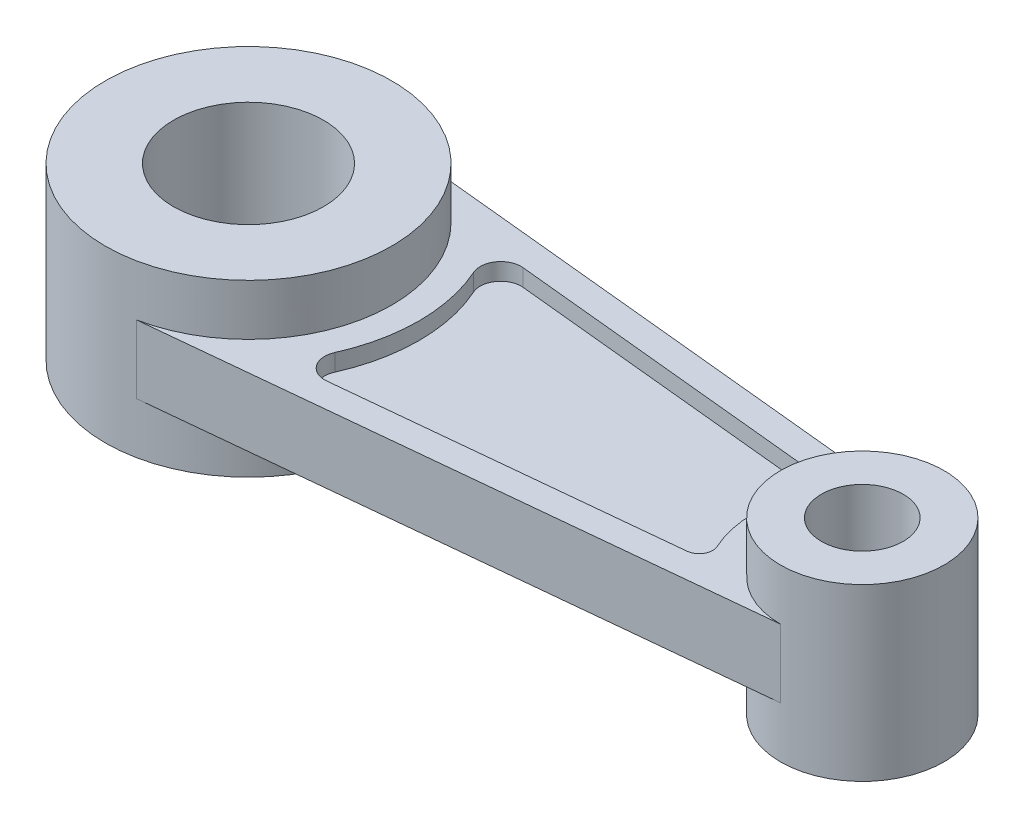
ISO-10303-21;
HEADER;
FILE_DESCRIPTION(('STEP AP214'),'2;1');
FILE_NAME('part.step','',(''),(''),'','','');
FILE_SCHEMA(('AUTOMOTIVE_DESIGN { 1 0 10303 214 1 1 1 1 }'));
ENDSEC;
DATA;
#1=APPLICATION_CONTEXT('core data for automotive mechanical design processes');
#2=APPLICATION_PROTOCOL_DEFINITION('international standard','automotive_design',2000,#1);
#3=PRODUCT_CONTEXT('',#1,'mechanical');
#4=PRODUCT('Part','Part','',(#3));
#5=PRODUCT_RELATED_PRODUCT_CATEGORY('part','',(#4));
#6=PRODUCT_DEFINITION_FORMATION('','',#4);
#7=PRODUCT_DEFINITION_CONTEXT('part definition',#1,'design');
#8=PRODUCT_DEFINITION('design','',#6,#7);
#9=PRODUCT_DEFINITION_SHAPE('','',#8);
#10=(LENGTH_UNIT() NAMED_UNIT(*) SI_UNIT(.MILLI.,.METRE.));
#11=(NAMED_UNIT(*) PLANE_ANGLE_UNIT() SI_UNIT($,.RADIAN.));
#12=(NAMED_UNIT(*) SI_UNIT($,.STERADIAN.) SOLID_ANGLE_UNIT());
#13=UNCERTAINTY_MEASURE_WITH_UNIT(LENGTH_MEASURE(1.E-05),#10,'distance_accuracy_value','');
#14=(GEOMETRIC_REPRESENTATION_CONTEXT(3) GLOBAL_UNCERTAINTY_ASSIGNED_CONTEXT((#13)) GLOBAL_UNIT_ASSIGNED_CONTEXT((#10,
#11,#12)) REPRESENTATION_CONTEXT('',''));
#15=CARTESIAN_POINT('',(0.,0.,0.));
#16=DIRECTION('',(0.,0.,1.));
#17=DIRECTION('',(1.,0.,0.));
#18=AXIS2_PLACEMENT_3D('',#15,#16,#17);
#19=CARTESIAN_POINT('',(0.,0.,0.));
#20=DIRECTION('',(0.,1.,0.));
#21=DIRECTION('',(0.,0.,1.));
#22=AXIS2_PLACEMENT_3D('',#19,#20,#21);
#23=PLANE('',#22);
#24=DIRECTION('',(0.995037190209989,0.,-0.0995037190209989));
#25=VECTOR('',#24,1.);
#26=CARTESIAN_POINT('',(0.,0.,21.));
#27=LINE('',#26,#25);
#28=CARTESIAN_POINT('',(4.15841584158416,0.,20.5841584158416));
#29=VERTEX_POINT('',#28);
#30=CARTESIAN_POINT('',(90.,0.,12.));
#31=VERTEX_POINT('',#30);
#32=EDGE_CURVE('E411',#29,#31,#27,.T.);
#33=ORIENTED_EDGE('',*,*,#32,.T.);
#34=CARTESIAN_POINT('',(90.,0.,0.));
#35=DIRECTION('',(0.,1.,0.));
#36=DIRECTION('',(0.,0.,1.));
#37=AXIS2_PLACEMENT_3D('',#34,#35,#36);
#38=CIRCLE('',#37,12.);
#39=CARTESIAN_POINT('',(90.,0.,-12.));
#40=VERTEX_POINT('',#39);
#41=EDGE_CURVE('E11',#31,#40,#38,.F.);
#42=ORIENTED_EDGE('',*,*,#41,.T.);
#43=DIRECTION('',(0.995037190209989,0.,0.0995037190209989));
#44=VECTOR('',#43,1.);
#45=CARTESIAN_POINT('',(0.,0.,-21.));
#46=LINE('',#45,#44);
#47=CARTESIAN_POINT('',(4.15841584158416,0.,-20.5841584158416));
#48=VERTEX_POINT('',#47);
#49=EDGE_CURVE('E417',#48,#40,#46,.T.);
#50=ORIENTED_EDGE('',*,*,#49,.F.);
#51=CARTESIAN_POINT('',(0.,0.,0.));
#52=DIRECTION('',(0.,1.,0.));
#53=DIRECTION('',(0.,0.,1.));
#54=AXIS2_PLACEMENT_3D('',#51,#52,#53);
#55=CIRCLE('',#54,21.);
#56=EDGE_CURVE('E381',#29,#48,#55,.T.);
#57=ORIENTED_EDGE('',*,*,#56,.F.);
#58=EDGE_LOOP('',(#33,#42,#50,#57));
#59=FACE_BOUND('',#58,.T.);
#60=CARTESIAN_POINT('',(25.57062730515,0.,-11.4080243347004));
#61=DIRECTION('',(0.,1.,0.));
#62=DIRECTION('',(0.,0.,1.));
#63=AXIS2_PLACEMENT_3D('',#60,#61,#62);
#64=CIRCLE('',#63,3.);
#65=CARTESIAN_POINT('',(25.869138462213,0.,-14.3931359053303));
#66=VERTEX_POINT('',#65);
#67=CARTESIAN_POINT('',(22.8309172367411,0.,-10.1857360131253));
#68=VERTEX_POINT('',#67);
#69=EDGE_CURVE('E67',#66,#68,#64,.T.);
#70=ORIENTED_EDGE('',*,*,#69,.F.);
#71=DIRECTION('',(-0.995037190209989,0.,-0.0995037190209988));
#72=VECTOR('',#71,1.);
#73=CARTESIAN_POINT('',(25.869138462213,0.,-14.3931359053303));
#74=LINE('',#73,#72);
#75=CARTESIAN_POINT('',(73.8829287654124,0.,-9.5917568750104));
#76=VERTEX_POINT('',#75);
#77=EDGE_CURVE('E280',#76,#66,#74,.T.);
#78=ORIENTED_EDGE('',*,*,#77,.F.);
#79=CARTESIAN_POINT('',(73.6839213273704,0.,-7.60168249459042));
#80=DIRECTION('',(0.,1.,0.));
#81=DIRECTION('',(0.,0.,1.));
#82=AXIS2_PLACEMENT_3D('',#79,#80,#81);
#83=CIRCLE('',#82,2.);
#84=CARTESIAN_POINT('',(75.4968189576626,0.,-6.7570511063026));
#85=VERTEX_POINT('',#84);
#86=EDGE_CURVE('E331',#85,#76,#83,.T.);
#87=ORIENTED_EDGE('',*,*,#86,.F.);
#88=CARTESIAN_POINT('',(90.,0.,0.));
#89=DIRECTION('',(0.,-1.,0.));
#90=DIRECTION('',(0.,0.,1.));
#91=AXIS2_PLACEMENT_3D('',#88,#89,#90);
#92=CIRCLE('',#91,16.);
#93=CARTESIAN_POINT('',(75.4968189576626,0.,6.7570511063026));
#94=VERTEX_POINT('',#93);
#95=EDGE_CURVE('E327',#94,#85,#92,.T.);
#96=ORIENTED_EDGE('',*,*,#95,.F.);
#97=CARTESIAN_POINT('',(73.6839213273704,0.,7.60168249459043));
#98=DIRECTION('',(0.,1.,0.));
#99=DIRECTION('',(0.,0.,-1.));
#100=AXIS2_PLACEMENT_3D('',#97,#98,#99);
#101=CIRCLE('',#100,2.);
#102=CARTESIAN_POINT('',(73.8829287654124,0.,9.59175687501041));
#103=VERTEX_POINT('',#102);
#104=EDGE_CURVE('E323',#103,#94,#101,.T.);
#105=ORIENTED_EDGE('',*,*,#104,.F.);
#106=DIRECTION('',(0.995037190209989,0.,-0.0995037190209987));
#107=VECTOR('',#106,1.);
#108=CARTESIAN_POINT('',(25.869138462213,0.,14.3931359053303));
#109=LINE('',#108,#107);
#110=CARTESIAN_POINT('',(25.869138462213,0.,14.3931359053303));
#111=VERTEX_POINT('',#110);
#112=EDGE_CURVE('E319',#111,#103,#109,.T.);
#113=ORIENTED_EDGE('',*,*,#112,.F.);
#114=CARTESIAN_POINT('',(25.57062730515,0.,11.4080243347004));
#115=DIRECTION('',(0.,1.,0.));
#116=DIRECTION('',(0.,0.,-1.));
#117=AXIS2_PLACEMENT_3D('',#114,#115,#116);
#118=CIRCLE('',#117,3.);
#119=CARTESIAN_POINT('',(22.8309172367411,0.,10.1857360131253));
#120=VERTEX_POINT('',#119);
#121=EDGE_CURVE('E315',#120,#111,#118,.T.);
#122=ORIENTED_EDGE('',*,*,#121,.F.);
#123=CARTESIAN_POINT('',(0.,0.,0.));
#124=DIRECTION('',(0.,-1.,0.));
#125=DIRECTION('',(0.,0.,1.));
#126=AXIS2_PLACEMENT_3D('',#123,#124,#125);
#127=CIRCLE('',#126,25.);
#128=EDGE_CURVE('E311',#68,#120,#127,.T.);
#129=ORIENTED_EDGE('',*,*,#128,.F.);
#130=EDGE_LOOP('',(#70,#78,#87,#96,#105,#113,#122,#129));
#131=FACE_BOUND('',#130,.T.);
#132=ADVANCED_FACE('F43',(#59,#131),#23,.T.);
#133=CARTESIAN_POINT('',(0.,-10.,0.));
#134=DIRECTION('',(0.,1.,0.));
#135=DIRECTION('',(0.,0.,1.));
#136=AXIS2_PLACEMENT_3D('',#133,#134,#135);
#137=CYLINDRICAL_SURFACE('',#136,21.);
#138=DIRECTION('',(0.,1.,0.));
#139=VECTOR('',#138,1.);
#140=CARTESIAN_POINT('',(4.1584158415841,-17.5,20.5841584158416));
#141=LINE('',#140,#139);
#142=CARTESIAN_POINT('',(4.15841584158416,-10.,20.5841584158416));
#143=VERTEX_POINT('',#142);
#144=EDGE_CURVE('E404',#143,#29,#141,.T.);
#145=ORIENTED_EDGE('',*,*,#144,.T.);
#146=ORIENTED_EDGE('',*,*,#56,.T.);
#147=DIRECTION('',(0.,1.,0.));
#148=VECTOR('',#147,1.);
#149=CARTESIAN_POINT('',(4.1584158415841,-17.5,-20.5841584158416));
#150=LINE('',#149,#148);
#151=CARTESIAN_POINT('',(4.15841584158416,-10.,-20.5841584158416));
#152=VERTEX_POINT('',#151);
#153=EDGE_CURVE('E408',#152,#48,#150,.T.);
#154=ORIENTED_EDGE('',*,*,#153,.F.);
#155=CARTESIAN_POINT('',(0.,-10.,0.));
#156=DIRECTION('',(0.,1.,0.));
#157=DIRECTION('',(0.,0.,1.));
#158=AXIS2_PLACEMENT_3D('',#155,#156,#157);
#159=CIRCLE('',#158,21.);
#160=EDGE_CURVE('E400',#143,#152,#159,.T.);
#161=ORIENTED_EDGE('',*,*,#160,.F.);
#162=EDGE_LOOP('',(#145,#146,#154,#161));
#163=FACE_BOUND('',#162,.T.);
#164=CARTESIAN_POINT('',(0.,-17.5,0.));
#165=DIRECTION('',(0.,1.,0.));
#166=DIRECTION('',(0.,0.,1.));
#167=AXIS2_PLACEMENT_3D('',#164,#165,#166);
#168=CIRCLE('',#167,21.);
#169=CARTESIAN_POINT('',(0.,-17.5,21.));
#170=VERTEX_POINT('',#169);
#171=EDGE_CURVE('E396',#170,#170,#168,.T.);
#172=ORIENTED_EDGE('',*,*,#171,.T.);
#173=EDGE_LOOP('',(#172));
#174=FACE_BOUND('',#173,.T.);
#175=CARTESIAN_POINT('',(0.,7.5,0.));
#176=DIRECTION('',(0.,1.,0.));
#177=DIRECTION('',(0.,0.,1.));
#178=AXIS2_PLACEMENT_3D('',#175,#176,#177);
#179=CIRCLE('',#178,21.);
#180=CARTESIAN_POINT('',(0.,7.5,21.));
#181=VERTEX_POINT('',#180);
#182=EDGE_CURVE('E382',#181,#181,#179,.T.);
#183=ORIENTED_EDGE('',*,*,#182,.F.);
#184=EDGE_LOOP('',(#183));
#185=FACE_BOUND('',#184,.T.);
#186=ADVANCED_FACE('F45',(#163,#174,#185),#137,.T.);
#187=CARTESIAN_POINT('',(0.,-10.,-21.));
#188=DIRECTION('',(-0.0995037190209989,0.,0.995037190209989));
#189=DIRECTION('',(0.995037190209989,0.,0.0995037190209989));
#190=AXIS2_PLACEMENT_3D('',#187,#188,#189);
#191=PLANE('',#190);
#192=DIRECTION('',(0.995037190209989,0.,0.0995037190209989));
#193=VECTOR('',#192,1.);
#194=CARTESIAN_POINT('',(0.,-10.,-21.));
#195=LINE('',#194,#193);
#196=CARTESIAN_POINT('',(90.,-10.,-12.));
#197=VERTEX_POINT('',#196);
#198=EDGE_CURVE('E416',#152,#197,#195,.T.);
#199=ORIENTED_EDGE('',*,*,#198,.F.);
#200=ORIENTED_EDGE('',*,*,#153,.T.);
#201=ORIENTED_EDGE('',*,*,#49,.T.);
#202=DIRECTION('',(0.,1.,0.));
#203=VECTOR('',#202,1.);
#204=CARTESIAN_POINT('',(90.,-10.,-12.));
#205=LINE('',#204,#203);
#206=EDGE_CURVE('E52',#197,#40,#205,.T.);
#207=ORIENTED_EDGE('',*,*,#206,.F.);
#208=EDGE_LOOP('',(#199,#200,#201,#207));
#209=FACE_BOUND('',#208,.T.);
#210=ADVANCED_FACE('F450',(#209),#191,.F.);
#211=CARTESIAN_POINT('',(90.,-10.,0.));
#212=DIRECTION('',(0.,1.,0.));
#213=DIRECTION('',(0.,0.,1.));
#214=AXIS2_PLACEMENT_3D('',#211,#212,#213);
#215=CYLINDRICAL_SURFACE('',#214,12.);
#216=ORIENTED_EDGE('',*,*,#206,.T.);
#217=ORIENTED_EDGE('',*,*,#41,.F.);
#218=DIRECTION('',(0.,1.,0.));
#219=VECTOR('',#218,1.);
#220=CARTESIAN_POINT('',(90.,-10.,12.));
#221=LINE('',#220,#219);
#222=CARTESIAN_POINT('',(90.,-10.,12.));
#223=VERTEX_POINT('',#222);
#224=EDGE_CURVE('E421',#223,#31,#221,.T.);
#225=ORIENTED_EDGE('',*,*,#224,.F.);
#226=CARTESIAN_POINT('',(90.,-10.,0.));
#227=DIRECTION('',(0.,1.,0.));
#228=DIRECTION('',(0.,0.,1.));
#229=AXIS2_PLACEMENT_3D('',#226,#227,#228);
#230=CIRCLE('',#229,12.);
#231=EDGE_CURVE('E393',#197,#223,#230,.T.);
#232=ORIENTED_EDGE('',*,*,#231,.F.);
#233=EDGE_LOOP('',(#216,#217,#225,#232));
#234=FACE_BOUND('',#233,.T.);
#235=CARTESIAN_POINT('',(90.,-17.5,0.));
#236=DIRECTION('',(0.,1.,0.));
#237=DIRECTION('',(0.,0.,1.));
#238=AXIS2_PLACEMENT_3D('',#235,#236,#237);
#239=CIRCLE('',#238,12.);
#240=CARTESIAN_POINT('',(90.,-17.5,12.));
#241=VERTEX_POINT('',#240);
#242=EDGE_CURVE('E386',#241,#241,#239,.T.);
#243=ORIENTED_EDGE('',*,*,#242,.T.);
#244=EDGE_LOOP('',(#243));
#245=FACE_BOUND('',#244,.T.);
#246=CARTESIAN_POINT('',(90.,7.5,0.));
#247=DIRECTION('',(0.,1.,0.));
#248=DIRECTION('',(0.,0.,1.));
#249=AXIS2_PLACEMENT_3D('',#246,#247,#248);
#250=CIRCLE('',#249,12.);
#251=CARTESIAN_POINT('',(90.,7.5,12.));
#252=VERTEX_POINT('',#251);
#253=EDGE_CURVE('E377',#252,#252,#250,.T.);
#254=ORIENTED_EDGE('',*,*,#253,.F.);
#255=EDGE_LOOP('',(#254));
#256=FACE_BOUND('',#255,.T.);
#257=ADVANCED_FACE('F437',(#234,#245,#256),#215,.T.);
#258=CARTESIAN_POINT('',(0.,-10.,21.));
#259=DIRECTION('',(0.0995037190209989,0.,0.995037190209989));
#260=DIRECTION('',(0.995037190209989,0.,-0.0995037190209989));
#261=AXIS2_PLACEMENT_3D('',#258,#259,#260);
#262=PLANE('',#261);
#263=ORIENTED_EDGE('',*,*,#144,.F.);
#264=DIRECTION('',(0.995037190209989,0.,-0.0995037190209989));
#265=VECTOR('',#264,1.);
#266=CARTESIAN_POINT('',(0.,-10.,21.));
#267=LINE('',#266,#265);
#268=EDGE_CURVE('E412',#143,#223,#267,.T.);
#269=ORIENTED_EDGE('',*,*,#268,.T.);
#270=ORIENTED_EDGE('',*,*,#224,.T.);
#271=ORIENTED_EDGE('',*,*,#32,.F.);
#272=EDGE_LOOP('',(#263,#269,#270,#271));
#273=FACE_BOUND('',#272,.T.);
#274=ADVANCED_FACE('F434',(#273),#262,.T.);
#275=CARTESIAN_POINT('',(0.,-10.,0.));
#276=DIRECTION('',(0.,1.,0.));
#277=DIRECTION('',(0.,0.,1.));
#278=AXIS2_PLACEMENT_3D('',#275,#276,#277);
#279=PLANE('',#278);
#280=DIRECTION('',(-0.995037190209989,0.,0.0995037190209987));
#281=VECTOR('',#280,1.);
#282=CARTESIAN_POINT('',(25.869138462213,-10.,14.3931359053303));
#283=LINE('',#282,#281);
#284=CARTESIAN_POINT('',(73.8829287654124,-10.,9.59175687501041));
#285=VERTEX_POINT('',#284);
#286=CARTESIAN_POINT('',(25.869138462213,-10.,14.3931359053303));
#287=VERTEX_POINT('',#286);
#288=EDGE_CURVE('E233',#285,#287,#283,.T.);
#289=ORIENTED_EDGE('',*,*,#288,.F.);
#290=CARTESIAN_POINT('',(73.6839213273704,-10.,7.60168249459043));
#291=DIRECTION('',(0.,-1.,0.));
#292=DIRECTION('',(0.,0.,-1.));
#293=AXIS2_PLACEMENT_3D('',#290,#291,#292);
#294=CIRCLE('',#293,2.);
#295=CARTESIAN_POINT('',(75.4968189576626,-10.,6.75705110630261));
#296=VERTEX_POINT('',#295);
#297=EDGE_CURVE('E59',#296,#285,#294,.T.);
#298=ORIENTED_EDGE('',*,*,#297,.F.);
#299=CARTESIAN_POINT('',(90.,-10.,0.));
#300=DIRECTION('',(0.,1.,0.));
#301=DIRECTION('',(0.,0.,-1.));
#302=AXIS2_PLACEMENT_3D('',#299,#300,#301);
#303=CIRCLE('',#302,16.);
#304=CARTESIAN_POINT('',(75.4968189576626,-10.,-6.75705110630259));
#305=VERTEX_POINT('',#304);
#306=EDGE_CURVE('E205',#305,#296,#303,.T.);
#307=ORIENTED_EDGE('',*,*,#306,.F.);
#308=CARTESIAN_POINT('',(73.6839213273704,-10.,-7.60168249459042));
#309=DIRECTION('',(0.,-1.,0.));
#310=DIRECTION('',(0.,0.,1.));
#311=AXIS2_PLACEMENT_3D('',#308,#309,#310);
#312=CIRCLE('',#311,2.);
#313=CARTESIAN_POINT('',(73.8829287654124,-10.,-9.5917568750104));
#314=VERTEX_POINT('',#313);
#315=EDGE_CURVE('E209',#314,#305,#312,.T.);
#316=ORIENTED_EDGE('',*,*,#315,.F.);
#317=DIRECTION('',(0.995037190209989,0.,0.0995037190209988));
#318=VECTOR('',#317,1.);
#319=CARTESIAN_POINT('',(25.869138462213,-10.,-14.3931359053303));
#320=LINE('',#319,#318);
#321=CARTESIAN_POINT('',(25.869138462213,-10.,-14.3931359053303));
#322=VERTEX_POINT('',#321);
#323=EDGE_CURVE('E248',#322,#314,#320,.T.);
#324=ORIENTED_EDGE('',*,*,#323,.F.);
#325=CARTESIAN_POINT('',(25.57062730515,-10.,-11.4080243347004));
#326=DIRECTION('',(0.,-1.,0.));
#327=DIRECTION('',(0.,0.,1.));
#328=AXIS2_PLACEMENT_3D('',#325,#326,#327);
#329=CIRCLE('',#328,3.);
#330=CARTESIAN_POINT('',(22.8309172367411,-10.,-10.1857360131253));
#331=VERTEX_POINT('',#330);
#332=EDGE_CURVE('E244',#331,#322,#329,.T.);
#333=ORIENTED_EDGE('',*,*,#332,.F.);
#334=CARTESIAN_POINT('',(0.,-10.,0.));
#335=DIRECTION('',(0.,1.,0.));
#336=DIRECTION('',(0.,0.,-1.));
#337=AXIS2_PLACEMENT_3D('',#334,#335,#336);
#338=CIRCLE('',#337,25.);
#339=CARTESIAN_POINT('',(22.8309172367411,-10.,10.1857360131253));
#340=VERTEX_POINT('',#339);
#341=EDGE_CURVE('E240',#340,#331,#338,.T.);
#342=ORIENTED_EDGE('',*,*,#341,.F.);
#343=CARTESIAN_POINT('',(25.57062730515,-10.,11.4080243347004));
#344=DIRECTION('',(0.,-1.,0.));
#345=DIRECTION('',(0.,0.,-1.));
#346=AXIS2_PLACEMENT_3D('',#343,#344,#345);
#347=CIRCLE('',#346,3.);
#348=EDGE_CURVE('E236',#287,#340,#347,.T.);
#349=ORIENTED_EDGE('',*,*,#348,.F.);
#350=EDGE_LOOP('',(#289,#298,#307,#316,#324,#333,#342,#349));
#351=FACE_BOUND('',#350,.T.);
#352=ORIENTED_EDGE('',*,*,#198,.T.);
#353=ORIENTED_EDGE('',*,*,#231,.T.);
#354=ORIENTED_EDGE('',*,*,#268,.F.);
#355=ORIENTED_EDGE('',*,*,#160,.T.);
#356=EDGE_LOOP('',(#352,#353,#354,#355));
#357=FACE_BOUND('',#356,.T.);
#358=ADVANCED_FACE('F447',(#351,#357),#279,.F.);
#359=CARTESIAN_POINT('',(0.,-17.5,0.));
#360=DIRECTION('',(0.,1.,0.));
#361=DIRECTION('',(0.,0.,1.));
#362=AXIS2_PLACEMENT_3D('',#359,#360,#361);
#363=PLANE('',#362);
#364=CARTESIAN_POINT('',(0.,-17.5,0.));
#365=DIRECTION('',(0.,1.,0.));
#366=DIRECTION('',(0.,0.,1.));
#367=AXIS2_PLACEMENT_3D('',#364,#365,#366);
#368=CIRCLE('',#367,11.);
#369=CARTESIAN_POINT('',(0.,-17.5,11.));
#370=VERTEX_POINT('',#369);
#371=EDGE_CURVE('E373',#370,#370,#368,.T.);
#372=ORIENTED_EDGE('',*,*,#371,.T.);
#373=EDGE_LOOP('',(#372));
#374=FACE_BOUND('',#373,.T.);
#375=ORIENTED_EDGE('',*,*,#171,.F.);
#376=EDGE_LOOP('',(#375));
#377=FACE_BOUND('',#376,.T.);
#378=ADVANCED_FACE('F465',(#374,#377),#363,.F.);
#379=CARTESIAN_POINT('',(90.,-17.5,0.));
#380=DIRECTION('',(0.,1.,0.));
#381=DIRECTION('',(0.,0.,1.));
#382=AXIS2_PLACEMENT_3D('',#379,#380,#381);
#383=PLANE('',#382);
#384=CARTESIAN_POINT('',(90.,-17.5,0.));
#385=DIRECTION('',(0.,1.,0.));
#386=DIRECTION('',(0.,0.,1.));
#387=AXIS2_PLACEMENT_3D('',#384,#385,#386);
#388=CIRCLE('',#387,6.);
#389=CARTESIAN_POINT('',(90.,-17.5,6.));
#390=VERTEX_POINT('',#389);
#391=EDGE_CURVE('E366',#390,#390,#388,.T.);
#392=ORIENTED_EDGE('',*,*,#391,.T.);
#393=EDGE_LOOP('',(#392));
#394=FACE_BOUND('',#393,.T.);
#395=ORIENTED_EDGE('',*,*,#242,.F.);
#396=EDGE_LOOP('',(#395));
#397=FACE_BOUND('',#396,.T.);
#398=ADVANCED_FACE('F469',(#394,#397),#383,.F.);
#399=CARTESIAN_POINT('',(0.,7.5,0.));
#400=DIRECTION('',(0.,1.,0.));
#401=DIRECTION('',(0.,0.,1.));
#402=AXIS2_PLACEMENT_3D('',#399,#400,#401);
#403=PLANE('',#402);
#404=CARTESIAN_POINT('',(0.,7.5,0.));
#405=DIRECTION('',(0.,1.,0.));
#406=DIRECTION('',(0.,0.,1.));
#407=AXIS2_PLACEMENT_3D('',#404,#405,#406);
#408=CIRCLE('',#407,11.);
#409=CARTESIAN_POINT('',(0.,7.5,11.));
#410=VERTEX_POINT('',#409);
#411=EDGE_CURVE('E362',#410,#410,#408,.T.);
#412=ORIENTED_EDGE('',*,*,#411,.F.);
#413=EDGE_LOOP('',(#412));
#414=FACE_BOUND('',#413,.T.);
#415=ORIENTED_EDGE('',*,*,#182,.T.);
#416=EDGE_LOOP('',(#415));
#417=FACE_BOUND('',#416,.T.);
#418=ADVANCED_FACE('F473',(#414,#417),#403,.T.);
#419=CARTESIAN_POINT('',(90.,7.5,0.));
#420=DIRECTION('',(0.,1.,0.));
#421=DIRECTION('',(0.,0.,1.));
#422=AXIS2_PLACEMENT_3D('',#419,#420,#421);
#423=PLANE('',#422);
#424=CARTESIAN_POINT('',(90.,7.5,0.));
#425=DIRECTION('',(0.,1.,0.));
#426=DIRECTION('',(0.,0.,1.));
#427=AXIS2_PLACEMENT_3D('',#424,#425,#426);
#428=CIRCLE('',#427,6.);
#429=CARTESIAN_POINT('',(90.,7.5,6.));
#430=VERTEX_POINT('',#429);
#431=EDGE_CURVE('E341',#430,#430,#428,.T.);
#432=ORIENTED_EDGE('',*,*,#431,.F.);
#433=EDGE_LOOP('',(#432));
#434=FACE_BOUND('',#433,.T.);
#435=ORIENTED_EDGE('',*,*,#253,.T.);
#436=EDGE_LOOP('',(#435));
#437=FACE_BOUND('',#436,.T.);
#438=ADVANCED_FACE('F477',(#434,#437),#423,.T.);
#439=CARTESIAN_POINT('',(90.,-31.,0.));
#440=DIRECTION('',(0.,1.,0.));
#441=DIRECTION('',(0.,0.,1.));
#442=AXIS2_PLACEMENT_3D('',#439,#440,#441);
#443=CYLINDRICAL_SURFACE('',#442,6.);
#444=ORIENTED_EDGE('',*,*,#431,.T.);
#445=EDGE_LOOP('',(#444));
#446=FACE_BOUND('',#445,.T.);
#447=ORIENTED_EDGE('',*,*,#391,.F.);
#448=EDGE_LOOP('',(#447));
#449=FACE_BOUND('',#448,.T.);
#450=ADVANCED_FACE('F481',(#446,#449),#443,.F.);
#451=CARTESIAN_POINT('',(0.,-31.,0.));
#452=DIRECTION('',(0.,1.,0.));
#453=DIRECTION('',(0.,0.,1.));
#454=AXIS2_PLACEMENT_3D('',#451,#452,#453);
#455=CYLINDRICAL_SURFACE('',#454,11.);
#456=ORIENTED_EDGE('',*,*,#411,.T.);
#457=EDGE_LOOP('',(#456));
#458=FACE_BOUND('',#457,.T.);
#459=ORIENTED_EDGE('',*,*,#371,.F.);
#460=EDGE_LOOP('',(#459));
#461=FACE_BOUND('',#460,.T.);
#462=ADVANCED_FACE('F485',(#458,#461),#455,.F.);
#463=CARTESIAN_POINT('',(25.57062730515,-2.5,-11.4080243347004));
#464=DIRECTION('',(0.,1.,0.));
#465=DIRECTION('',(0.,0.,1.));
#466=AXIS2_PLACEMENT_3D('',#463,#464,#465);
#467=CYLINDRICAL_SURFACE('',#466,3.);
#468=ORIENTED_EDGE('',*,*,#69,.T.);
#469=DIRECTION('',(0.,1.,0.));
#470=VECTOR('',#469,1.);
#471=CARTESIAN_POINT('',(22.8309172367411,-2.5,-10.1857360131253));
#472=LINE('',#471,#470);
#473=CARTESIAN_POINT('',(22.8309172367411,-2.5,-10.1857360131253));
#474=VERTEX_POINT('',#473);
#475=EDGE_CURVE('E308',#474,#68,#472,.T.);
#476=ORIENTED_EDGE('',*,*,#475,.F.);
#477=CARTESIAN_POINT('',(25.57062730515,-2.5,-11.4080243347004));
#478=DIRECTION('',(0.,1.,0.));
#479=DIRECTION('',(0.,0.,1.));
#480=AXIS2_PLACEMENT_3D('',#477,#478,#479);
#481=CIRCLE('',#480,3.);
#482=CARTESIAN_POINT('',(25.869138462213,-2.5,-14.3931359053303));
#483=VERTEX_POINT('',#482);
#484=EDGE_CURVE('E275',#483,#474,#481,.T.);
#485=ORIENTED_EDGE('',*,*,#484,.F.);
#486=DIRECTION('',(0.,1.,0.));
#487=VECTOR('',#486,1.);
#488=CARTESIAN_POINT('',(25.869138462213,-2.5,-14.3931359053303));
#489=LINE('',#488,#487);
#490=EDGE_CURVE('E338',#483,#66,#489,.T.);
#491=ORIENTED_EDGE('',*,*,#490,.T.);
#492=EDGE_LOOP('',(#468,#476,#485,#491));
#493=FACE_BOUND('',#492,.T.);
#494=ADVANCED_FACE('F489',(#493),#467,.F.);
#495=CARTESIAN_POINT('',(25.869138462213,-2.5,-14.3931359053303));
#496=DIRECTION('',(0.0995037190209988,0.,-0.995037190209989));
#497=DIRECTION('',(-0.995037190209989,0.,-0.0995037190209988));
#498=AXIS2_PLACEMENT_3D('',#495,#496,#497);
#499=PLANE('',#498);
#500=ORIENTED_EDGE('',*,*,#77,.T.);
#501=ORIENTED_EDGE('',*,*,#490,.F.);
#502=DIRECTION('',(-0.995037190209989,0.,-0.0995037190209988));
#503=VECTOR('',#502,1.);
#504=CARTESIAN_POINT('',(25.869138462213,-2.5,-14.3931359053303));
#505=LINE('',#504,#503);
#506=CARTESIAN_POINT('',(73.8829287654124,-2.5,-9.5917568750104));
#507=VERTEX_POINT('',#506);
#508=EDGE_CURVE('E304',#507,#483,#505,.T.);
#509=ORIENTED_EDGE('',*,*,#508,.F.);
#510=DIRECTION('',(0.,1.,0.));
#511=VECTOR('',#510,1.);
#512=CARTESIAN_POINT('',(73.8829287654124,-2.5,-9.5917568750104));
#513=LINE('',#512,#511);
#514=EDGE_CURVE('E342',#507,#76,#513,.T.);
#515=ORIENTED_EDGE('',*,*,#514,.T.);
#516=EDGE_LOOP('',(#500,#501,#509,#515));
#517=FACE_BOUND('',#516,.T.);
#518=ADVANCED_FACE('F493',(#517),#499,.F.);
#519=CARTESIAN_POINT('',(73.6839213273704,-2.5,-7.60168249459042));
#520=DIRECTION('',(0.,1.,0.));
#521=DIRECTION('',(0.,0.,1.));
#522=AXIS2_PLACEMENT_3D('',#519,#520,#521);
#523=CYLINDRICAL_SURFACE('',#522,2.);
#524=ORIENTED_EDGE('',*,*,#86,.T.);
#525=ORIENTED_EDGE('',*,*,#514,.F.);
#526=CARTESIAN_POINT('',(73.6839213273704,-2.5,-7.60168249459042));
#527=DIRECTION('',(0.,1.,0.));
#528=DIRECTION('',(0.,0.,1.));
#529=AXIS2_PLACEMENT_3D('',#526,#527,#528);
#530=CIRCLE('',#529,2.);
#531=CARTESIAN_POINT('',(75.4968189576626,-2.5,-6.7570511063026));
#532=VERTEX_POINT('',#531);
#533=EDGE_CURVE('E300',#532,#507,#530,.T.);
#534=ORIENTED_EDGE('',*,*,#533,.F.);
#535=DIRECTION('',(0.,1.,0.));
#536=VECTOR('',#535,1.);
#537=CARTESIAN_POINT('',(75.4968189576626,-2.5,-6.7570511063026));
#538=LINE('',#537,#536);
#539=EDGE_CURVE('E345',#532,#85,#538,.T.);
#540=ORIENTED_EDGE('',*,*,#539,.T.);
#541=EDGE_LOOP('',(#524,#525,#534,#540));
#542=FACE_BOUND('',#541,.T.);
#543=ADVANCED_FACE('F514',(#542),#523,.F.);
#544=CARTESIAN_POINT('',(90.,-2.5,0.));
#545=DIRECTION('',(0.,1.,0.));
#546=DIRECTION('',(0.,0.,1.));
#547=AXIS2_PLACEMENT_3D('',#544,#545,#546);
#548=CYLINDRICAL_SURFACE('',#547,16.);
#549=ORIENTED_EDGE('',*,*,#95,.T.);
#550=ORIENTED_EDGE('',*,*,#539,.F.);
#551=CARTESIAN_POINT('',(90.,-2.5,0.));
#552=DIRECTION('',(0.,-1.,0.));
#553=DIRECTION('',(0.,0.,1.));
#554=AXIS2_PLACEMENT_3D('',#551,#552,#553);
#555=CIRCLE('',#554,16.);
#556=CARTESIAN_POINT('',(75.4968189576626,-2.5,6.7570511063026));
#557=VERTEX_POINT('',#556);
#558=EDGE_CURVE('E296',#557,#532,#555,.T.);
#559=ORIENTED_EDGE('',*,*,#558,.F.);
#560=DIRECTION('',(0.,1.,0.));
#561=VECTOR('',#560,1.);
#562=CARTESIAN_POINT('',(75.4968189576626,-2.5,6.7570511063026));
#563=LINE('',#562,#561);
#564=EDGE_CURVE('E348',#557,#94,#563,.T.);
#565=ORIENTED_EDGE('',*,*,#564,.T.);
#566=EDGE_LOOP('',(#549,#550,#559,#565));
#567=FACE_BOUND('',#566,.T.);
#568=ADVANCED_FACE('F510',(#567),#548,.T.);
#569=CARTESIAN_POINT('',(73.6839213273704,-2.5,7.60168249459043));
#570=DIRECTION('',(0.,1.,0.));
#571=DIRECTION('',(0.,0.,1.));
#572=AXIS2_PLACEMENT_3D('',#569,#570,#571);
#573=CYLINDRICAL_SURFACE('',#572,2.);
#574=ORIENTED_EDGE('',*,*,#104,.T.);
#575=ORIENTED_EDGE('',*,*,#564,.F.);
#576=CARTESIAN_POINT('',(73.6839213273704,-2.5,7.60168249459043));
#577=DIRECTION('',(0.,1.,0.));
#578=DIRECTION('',(0.,0.,-1.));
#579=AXIS2_PLACEMENT_3D('',#576,#577,#578);
#580=CIRCLE('',#579,2.);
#581=CARTESIAN_POINT('',(73.8829287654124,-2.5,9.59175687501041));
#582=VERTEX_POINT('',#581);
#583=EDGE_CURVE('E292',#582,#557,#580,.T.);
#584=ORIENTED_EDGE('',*,*,#583,.F.);
#585=DIRECTION('',(0.,1.,0.));
#586=VECTOR('',#585,1.);
#587=CARTESIAN_POINT('',(73.8829287654124,-2.5,9.59175687501041));
#588=LINE('',#587,#586);
#589=EDGE_CURVE('E351',#582,#103,#588,.T.);
#590=ORIENTED_EDGE('',*,*,#589,.T.);
#591=EDGE_LOOP('',(#574,#575,#584,#590));
#592=FACE_BOUND('',#591,.T.);
#593=ADVANCED_FACE('F506',(#592),#573,.F.);
#594=CARTESIAN_POINT('',(25.869138462213,-2.5,14.3931359053303));
#595=DIRECTION('',(0.0995037190209987,0.,0.995037190209989));
#596=DIRECTION('',(0.995037190209989,0.,-0.0995037190209987));
#597=AXIS2_PLACEMENT_3D('',#594,#595,#596);
#598=PLANE('',#597);
#599=ORIENTED_EDGE('',*,*,#112,.T.);
#600=ORIENTED_EDGE('',*,*,#589,.F.);
#601=DIRECTION('',(0.995037190209989,0.,-0.0995037190209987));
#602=VECTOR('',#601,1.);
#603=CARTESIAN_POINT('',(25.869138462213,-2.5,14.3931359053303));
#604=LINE('',#603,#602);
#605=CARTESIAN_POINT('',(25.869138462213,-2.5,14.3931359053303));
#606=VERTEX_POINT('',#605);
#607=EDGE_CURVE('E288',#606,#582,#604,.T.);
#608=ORIENTED_EDGE('',*,*,#607,.F.);
#609=DIRECTION('',(0.,1.,0.));
#610=VECTOR('',#609,1.);
#611=CARTESIAN_POINT('',(25.869138462213,-2.5,14.3931359053303));
#612=LINE('',#611,#610);
#613=EDGE_CURVE('E354',#606,#111,#612,.T.);
#614=ORIENTED_EDGE('',*,*,#613,.T.);
#615=EDGE_LOOP('',(#599,#600,#608,#614));
#616=FACE_BOUND('',#615,.T.);
#617=ADVANCED_FACE('F502',(#616),#598,.F.);
#618=CARTESIAN_POINT('',(25.57062730515,-2.5,11.4080243347004));
#619=DIRECTION('',(0.,1.,0.));
#620=DIRECTION('',(0.,0.,1.));
#621=AXIS2_PLACEMENT_3D('',#618,#619,#620);
#622=CYLINDRICAL_SURFACE('',#621,3.);
#623=ORIENTED_EDGE('',*,*,#121,.T.);
#624=ORIENTED_EDGE('',*,*,#613,.F.);
#625=CARTESIAN_POINT('',(25.57062730515,-2.5,11.4080243347004));
#626=DIRECTION('',(0.,1.,0.));
#627=DIRECTION('',(0.,0.,-1.));
#628=AXIS2_PLACEMENT_3D('',#625,#626,#627);
#629=CIRCLE('',#628,3.);
#630=CARTESIAN_POINT('',(22.8309172367411,-2.5,10.1857360131253));
#631=VERTEX_POINT('',#630);
#632=EDGE_CURVE('E284',#631,#606,#629,.T.);
#633=ORIENTED_EDGE('',*,*,#632,.F.);
#634=DIRECTION('',(0.,1.,0.));
#635=VECTOR('',#634,1.);
#636=CARTESIAN_POINT('',(22.8309172367411,-2.5,10.1857360131253));
#637=LINE('',#636,#635);
#638=EDGE_CURVE('E357',#631,#120,#637,.T.);
#639=ORIENTED_EDGE('',*,*,#638,.T.);
#640=EDGE_LOOP('',(#623,#624,#633,#639));
#641=FACE_BOUND('',#640,.T.);
#642=ADVANCED_FACE('F498',(#641),#622,.F.);
#643=CARTESIAN_POINT('',(0.,-2.5,0.));
#644=DIRECTION('',(0.,1.,0.));
#645=DIRECTION('',(0.,0.,1.));
#646=AXIS2_PLACEMENT_3D('',#643,#644,#645);
#647=CYLINDRICAL_SURFACE('',#646,25.);
#648=ORIENTED_EDGE('',*,*,#128,.T.);
#649=ORIENTED_EDGE('',*,*,#638,.F.);
#650=CARTESIAN_POINT('',(0.,-2.5,0.));
#651=DIRECTION('',(0.,-1.,0.));
#652=DIRECTION('',(0.,0.,1.));
#653=AXIS2_PLACEMENT_3D('',#650,#651,#652);
#654=CIRCLE('',#653,25.);
#655=EDGE_CURVE('E279',#474,#631,#654,.T.);
#656=ORIENTED_EDGE('',*,*,#655,.F.);
#657=ORIENTED_EDGE('',*,*,#475,.T.);
#658=EDGE_LOOP('',(#648,#649,#656,#657));
#659=FACE_BOUND('',#658,.T.);
#660=ADVANCED_FACE('F494',(#659),#647,.T.);
#661=CARTESIAN_POINT('',(25.57062730515,-2.5,-11.4080243347004));
#662=DIRECTION('',(0.,1.,0.));
#663=DIRECTION('',(0.,0.,1.));
#664=AXIS2_PLACEMENT_3D('',#661,#662,#663);
#665=PLANE('',#664);
#666=ORIENTED_EDGE('',*,*,#484,.T.);
#667=ORIENTED_EDGE('',*,*,#655,.T.);
#668=ORIENTED_EDGE('',*,*,#632,.T.);
#669=ORIENTED_EDGE('',*,*,#607,.T.);
#670=ORIENTED_EDGE('',*,*,#583,.T.);
#671=ORIENTED_EDGE('',*,*,#558,.T.);
#672=ORIENTED_EDGE('',*,*,#533,.T.);
#673=ORIENTED_EDGE('',*,*,#508,.T.);
#674=EDGE_LOOP('',(#666,#667,#668,#669,#670,#671,#672,#673));
#675=FACE_BOUND('',#674,.T.);
#676=ADVANCED_FACE('F497',(#675),#665,.T.);
#677=CARTESIAN_POINT('',(73.6839213273704,-7.5,7.60168249459043));
#678=DIRECTION('',(0.,-1.,0.));
#679=DIRECTION('',(0.,0.,-1.));
#680=AXIS2_PLACEMENT_3D('',#677,#678,#679);
#681=CYLINDRICAL_SURFACE('',#680,2.);
#682=ORIENTED_EDGE('',*,*,#297,.T.);
#683=DIRECTION('',(0.,-1.,0.));
#684=VECTOR('',#683,1.);
#685=CARTESIAN_POINT('',(73.8829287654124,-7.5,9.59175687501041));
#686=LINE('',#685,#684);
#687=CARTESIAN_POINT('',(73.8829287654124,-7.5,9.59175687501041));
#688=VERTEX_POINT('',#687);
#689=EDGE_CURVE('E179',#688,#285,#686,.T.);
#690=ORIENTED_EDGE('',*,*,#689,.F.);
#691=CARTESIAN_POINT('',(73.6839213273704,-7.5,7.60168249459043));
#692=DIRECTION('',(0.,-1.,0.));
#693=DIRECTION('',(0.,0.,-1.));
#694=AXIS2_PLACEMENT_3D('',#691,#692,#693);
#695=CIRCLE('',#694,2.);
#696=CARTESIAN_POINT('',(75.4968189576626,-7.5,6.75705110630261));
#697=VERTEX_POINT('',#696);
#698=EDGE_CURVE('E183',#697,#688,#695,.T.);
#699=ORIENTED_EDGE('',*,*,#698,.F.);
#700=DIRECTION('',(0.,-1.,0.));
#701=VECTOR('',#700,1.);
#702=CARTESIAN_POINT('',(75.4968189576626,-7.5,6.75705110630261));
#703=LINE('',#702,#701);
#704=EDGE_CURVE('E255',#697,#296,#703,.T.);
#705=ORIENTED_EDGE('',*,*,#704,.T.);
#706=EDGE_LOOP('',(#682,#690,#699,#705));
#707=FACE_BOUND('',#706,.T.);
#708=ADVANCED_FACE('F181',(#707),#681,.F.);
#709=CARTESIAN_POINT('',(90.,-7.5,0.));
#710=DIRECTION('',(0.,-1.,0.));
#711=DIRECTION('',(0.,0.,-1.));
#712=AXIS2_PLACEMENT_3D('',#709,#710,#711);
#713=CYLINDRICAL_SURFACE('',#712,16.);
#714=ORIENTED_EDGE('',*,*,#306,.T.);
#715=ORIENTED_EDGE('',*,*,#704,.F.);
#716=CARTESIAN_POINT('',(90.,-7.5,0.));
#717=DIRECTION('',(0.,1.,0.));
#718=DIRECTION('',(0.,0.,-1.));
#719=AXIS2_PLACEMENT_3D('',#716,#717,#718);
#720=CIRCLE('',#719,16.);
#721=CARTESIAN_POINT('',(75.4968189576626,-7.5,-6.75705110630259));
#722=VERTEX_POINT('',#721);
#723=EDGE_CURVE('E190',#722,#697,#720,.T.);
#724=ORIENTED_EDGE('',*,*,#723,.F.);
#725=DIRECTION('',(0.,-1.,0.));
#726=VECTOR('',#725,1.);
#727=CARTESIAN_POINT('',(75.4968189576626,-7.5,-6.75705110630259));
#728=LINE('',#727,#726);
#729=EDGE_CURVE('E258',#722,#305,#728,.T.);
#730=ORIENTED_EDGE('',*,*,#729,.T.);
#731=EDGE_LOOP('',(#714,#715,#724,#730));
#732=FACE_BOUND('',#731,.T.);
#733=ADVANCED_FACE('F527',(#732),#713,.T.);
#734=CARTESIAN_POINT('',(73.6839213273704,-7.5,-7.60168249459042));
#735=DIRECTION('',(0.,-1.,0.));
#736=DIRECTION('',(0.,0.,-1.));
#737=AXIS2_PLACEMENT_3D('',#734,#735,#736);
#738=CYLINDRICAL_SURFACE('',#737,2.);
#739=ORIENTED_EDGE('',*,*,#315,.T.);
#740=ORIENTED_EDGE('',*,*,#729,.F.);
#741=CARTESIAN_POINT('',(73.6839213273704,-7.5,-7.60168249459042));
#742=DIRECTION('',(0.,-1.,0.));
#743=DIRECTION('',(0.,0.,1.));
#744=AXIS2_PLACEMENT_3D('',#741,#742,#743);
#745=CIRCLE('',#744,2.);
#746=CARTESIAN_POINT('',(73.8829287654124,-7.5,-9.5917568750104));
#747=VERTEX_POINT('',#746);
#748=EDGE_CURVE('E226',#747,#722,#745,.T.);
#749=ORIENTED_EDGE('',*,*,#748,.F.);
#750=DIRECTION('',(0.,-1.,0.));
#751=VECTOR('',#750,1.);
#752=CARTESIAN_POINT('',(73.8829287654124,-7.5,-9.5917568750104));
#753=LINE('',#752,#751);
#754=EDGE_CURVE('E261',#747,#314,#753,.T.);
#755=ORIENTED_EDGE('',*,*,#754,.T.);
#756=EDGE_LOOP('',(#739,#740,#749,#755));
#757=FACE_BOUND('',#756,.T.);
#758=ADVANCED_FACE('F545',(#757),#738,.F.);
#759=CARTESIAN_POINT('',(25.869138462213,-7.5,-14.3931359053303));
#760=DIRECTION('',(0.0995037190209988,0.,-0.995037190209989));
#761=DIRECTION('',(-0.995037190209989,0.,-0.0995037190209988));
#762=AXIS2_PLACEMENT_3D('',#759,#760,#761);
#763=PLANE('',#762);
#764=ORIENTED_EDGE('',*,*,#323,.T.);
#765=ORIENTED_EDGE('',*,*,#754,.F.);
#766=DIRECTION('',(0.995037190209989,0.,0.0995037190209988));
#767=VECTOR('',#766,1.);
#768=CARTESIAN_POINT('',(25.869138462213,-7.5,-14.3931359053303));
#769=LINE('',#768,#767);
#770=CARTESIAN_POINT('',(25.869138462213,-7.5,-14.3931359053303));
#771=VERTEX_POINT('',#770);
#772=EDGE_CURVE('E222',#771,#747,#769,.T.);
#773=ORIENTED_EDGE('',*,*,#772,.F.);
#774=DIRECTION('',(0.,-1.,0.));
#775=VECTOR('',#774,1.);
#776=CARTESIAN_POINT('',(25.869138462213,-7.5,-14.3931359053303));
#777=LINE('',#776,#775);
#778=EDGE_CURVE('E264',#771,#322,#777,.T.);
#779=ORIENTED_EDGE('',*,*,#778,.T.);
#780=EDGE_LOOP('',(#764,#765,#773,#779));
#781=FACE_BOUND('',#780,.T.);
#782=ADVANCED_FACE('F541',(#781),#763,.F.);
#783=CARTESIAN_POINT('',(25.57062730515,-7.5,-11.4080243347004));
#784=DIRECTION('',(0.,-1.,0.));
#785=DIRECTION('',(0.,0.,-1.));
#786=AXIS2_PLACEMENT_3D('',#783,#784,#785);
#787=CYLINDRICAL_SURFACE('',#786,3.);
#788=ORIENTED_EDGE('',*,*,#332,.T.);
#789=ORIENTED_EDGE('',*,*,#778,.F.);
#790=CARTESIAN_POINT('',(25.57062730515,-7.5,-11.4080243347004));
#791=DIRECTION('',(0.,-1.,0.));
#792=DIRECTION('',(0.,0.,1.));
#793=AXIS2_PLACEMENT_3D('',#790,#791,#792);
#794=CIRCLE('',#793,3.);
#795=CARTESIAN_POINT('',(22.8309172367411,-7.5,-10.1857360131253));
#796=VERTEX_POINT('',#795);
#797=EDGE_CURVE('E218',#796,#771,#794,.T.);
#798=ORIENTED_EDGE('',*,*,#797,.F.);
#799=DIRECTION('',(0.,-1.,0.));
#800=VECTOR('',#799,1.);
#801=CARTESIAN_POINT('',(22.8309172367411,-7.5,-10.1857360131253));
#802=LINE('',#801,#800);
#803=EDGE_CURVE('E267',#796,#331,#802,.T.);
#804=ORIENTED_EDGE('',*,*,#803,.T.);
#805=EDGE_LOOP('',(#788,#789,#798,#804));
#806=FACE_BOUND('',#805,.T.);
#807=ADVANCED_FACE('F537',(#806),#787,.F.);
#808=CARTESIAN_POINT('',(0.,-7.5,0.));
#809=DIRECTION('',(0.,-1.,0.));
#810=DIRECTION('',(0.,0.,-1.));
#811=AXIS2_PLACEMENT_3D('',#808,#809,#810);
#812=CYLINDRICAL_SURFACE('',#811,25.);
#813=ORIENTED_EDGE('',*,*,#341,.T.);
#814=ORIENTED_EDGE('',*,*,#803,.F.);
#815=CARTESIAN_POINT('',(0.,-7.5,0.));
#816=DIRECTION('',(0.,1.,0.));
#817=DIRECTION('',(0.,0.,-1.));
#818=AXIS2_PLACEMENT_3D('',#815,#816,#817);
#819=CIRCLE('',#818,25.);
#820=CARTESIAN_POINT('',(22.8309172367411,-7.5,10.1857360131253));
#821=VERTEX_POINT('',#820);
#822=EDGE_CURVE('E214',#821,#796,#819,.T.);
#823=ORIENTED_EDGE('',*,*,#822,.F.);
#824=DIRECTION('',(0.,-1.,0.));
#825=VECTOR('',#824,1.);
#826=CARTESIAN_POINT('',(22.8309172367411,-7.5,10.1857360131253));
#827=LINE('',#826,#825);
#828=EDGE_CURVE('E270',#821,#340,#827,.T.);
#829=ORIENTED_EDGE('',*,*,#828,.T.);
#830=EDGE_LOOP('',(#813,#814,#823,#829));
#831=FACE_BOUND('',#830,.T.);
#832=ADVANCED_FACE('F533',(#831),#812,.T.);
#833=CARTESIAN_POINT('',(25.57062730515,-7.5,11.4080243347004));
#834=DIRECTION('',(0.,-1.,0.));
#835=DIRECTION('',(0.,0.,-1.));
#836=AXIS2_PLACEMENT_3D('',#833,#834,#835);
#837=CYLINDRICAL_SURFACE('',#836,3.);
#838=ORIENTED_EDGE('',*,*,#348,.T.);
#839=ORIENTED_EDGE('',*,*,#828,.F.);
#840=CARTESIAN_POINT('',(25.57062730515,-7.5,11.4080243347004));
#841=DIRECTION('',(0.,-1.,0.));
#842=DIRECTION('',(0.,0.,-1.));
#843=AXIS2_PLACEMENT_3D('',#840,#841,#842);
#844=CIRCLE('',#843,3.);
#845=CARTESIAN_POINT('',(25.869138462213,-7.5,14.3931359053303));
#846=VERTEX_POINT('',#845);
#847=EDGE_CURVE('E199',#846,#821,#844,.T.);
#848=ORIENTED_EDGE('',*,*,#847,.F.);
#849=DIRECTION('',(0.,-1.,0.));
#850=VECTOR('',#849,1.);
#851=CARTESIAN_POINT('',(25.869138462213,-7.5,14.3931359053303));
#852=LINE('',#851,#850);
#853=EDGE_CURVE('E189',#846,#287,#852,.T.);
#854=ORIENTED_EDGE('',*,*,#853,.T.);
#855=EDGE_LOOP('',(#838,#839,#848,#854));
#856=FACE_BOUND('',#855,.T.);
#857=ADVANCED_FACE('F530',(#856),#837,.F.);
#858=CARTESIAN_POINT('',(25.869138462213,-7.5,14.3931359053303));
#859=DIRECTION('',(0.0995037190209987,0.,0.995037190209989));
#860=DIRECTION('',(0.995037190209989,0.,-0.0995037190209987));
#861=AXIS2_PLACEMENT_3D('',#858,#859,#860);
#862=PLANE('',#861);
#863=ORIENTED_EDGE('',*,*,#288,.T.);
#864=ORIENTED_EDGE('',*,*,#853,.F.);
#865=DIRECTION('',(-0.995037190209989,0.,0.0995037190209987));
#866=VECTOR('',#865,1.);
#867=CARTESIAN_POINT('',(25.869138462213,-7.5,14.3931359053303));
#868=LINE('',#867,#866);
#869=EDGE_CURVE('E193',#688,#846,#868,.T.);
#870=ORIENTED_EDGE('',*,*,#869,.F.);
#871=ORIENTED_EDGE('',*,*,#689,.T.);
#872=EDGE_LOOP('',(#863,#864,#870,#871));
#873=FACE_BOUND('',#872,.T.);
#874=ADVANCED_FACE('F194',(#873),#862,.F.);
#875=CARTESIAN_POINT('',(73.6839213273704,-7.5,7.60168249459043));
#876=DIRECTION('',(0.,-1.,0.));
#877=DIRECTION('',(0.,0.,-1.));
#878=AXIS2_PLACEMENT_3D('',#875,#876,#877);
#879=PLANE('',#878);
#880=ORIENTED_EDGE('',*,*,#698,.T.);
#881=ORIENTED_EDGE('',*,*,#869,.T.);
#882=ORIENTED_EDGE('',*,*,#847,.T.);
#883=ORIENTED_EDGE('',*,*,#822,.T.);
#884=ORIENTED_EDGE('',*,*,#797,.T.);
#885=ORIENTED_EDGE('',*,*,#772,.T.);
#886=ORIENTED_EDGE('',*,*,#748,.T.);
#887=ORIENTED_EDGE('',*,*,#723,.T.);
#888=EDGE_LOOP('',(#880,#881,#882,#883,#884,#885,#886,#887));
#889=FACE_BOUND('',#888,.T.);
#890=ADVANCED_FACE('F201',(#889),#879,.T.);
#891=CLOSED_SHELL('',(#132,#186,#210,#257,#274,#358,#378,#398,#418,#438,#450,#462,#494,#518,
#543,#568,#593,#617,#642,#660,#676,#708,#733,#758,#782,#807,#832,#857,#874,#890));
#892=MANIFOLD_SOLID_BREP('B2',#891);
#893=ADVANCED_BREP_SHAPE_REPRESENTATION('',(#18,#892),#14);
#894=SHAPE_DEFINITION_REPRESENTATION(#9,#893);
ENDSEC;
END-ISO-10303-21;
